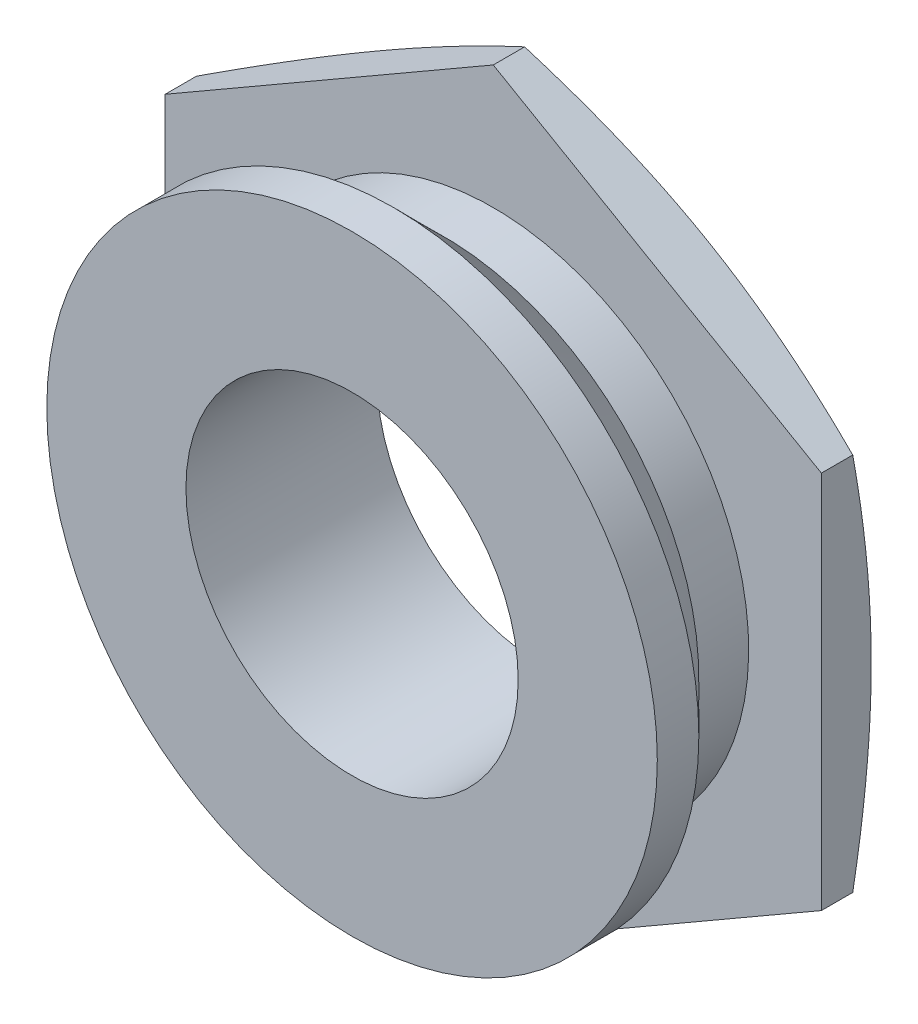
ISO-10303-21;
HEADER;
FILE_DESCRIPTION(('STEP AP214'),'2;1');
FILE_NAME('part.step','',(''),(''),'','','');
FILE_SCHEMA(('AUTOMOTIVE_DESIGN { 1 0 10303 214 1 1 1 1 }'));
ENDSEC;
DATA;
#1=APPLICATION_CONTEXT('core data for automotive mechanical design processes');
#2=APPLICATION_PROTOCOL_DEFINITION('international standard','automotive_design',2000,#1);
#3=PRODUCT_CONTEXT('',#1,'mechanical');
#4=PRODUCT('Part','Part','',(#3));
#5=PRODUCT_RELATED_PRODUCT_CATEGORY('part','',(#4));
#6=PRODUCT_DEFINITION_FORMATION('','',#4);
#7=PRODUCT_DEFINITION_CONTEXT('part definition',#1,'design');
#8=PRODUCT_DEFINITION('design','',#6,#7);
#9=PRODUCT_DEFINITION_SHAPE('','',#8);
#10=(LENGTH_UNIT() NAMED_UNIT(*) SI_UNIT(.MILLI.,.METRE.));
#11=(NAMED_UNIT(*) PLANE_ANGLE_UNIT() SI_UNIT($,.RADIAN.));
#12=(NAMED_UNIT(*) SI_UNIT($,.STERADIAN.) SOLID_ANGLE_UNIT());
#13=UNCERTAINTY_MEASURE_WITH_UNIT(LENGTH_MEASURE(1.E-05),#10,'distance_accuracy_value','');
#14=(GEOMETRIC_REPRESENTATION_CONTEXT(3) GLOBAL_UNCERTAINTY_ASSIGNED_CONTEXT((#13)) GLOBAL_UNIT_ASSIGNED_CONTEXT((#10,
#11,#12)) REPRESENTATION_CONTEXT('',''));
#15=CARTESIAN_POINT('',(0.,0.,0.));
#16=DIRECTION('',(0.,0.,1.));
#17=DIRECTION('',(1.,0.,0.));
#18=AXIS2_PLACEMENT_3D('',#15,#16,#17);
#19=CARTESIAN_POINT('',(0.,3.075,0.));
#20=DIRECTION('',(0.,0.,1.));
#21=DIRECTION('',(0.,-1.,0.));
#22=AXIS2_PLACEMENT_3D('',#19,#20,#21);
#23=PLANE('',#22);
#24=DIRECTION('',(-0.866025403784439,-0.5,0.));
#25=VECTOR('',#24,1.);
#26=CARTESIAN_POINT('',(3.95,-2.28053356329902,0.));
#27=LINE('',#26,#25);
#28=CARTESIAN_POINT('',(3.95,-2.28053356329902,0.));
#29=VERTEX_POINT('',#28);
#30=CARTESIAN_POINT('',(0.,-4.56106712659804,0.));
#31=VERTEX_POINT('',#30);
#32=EDGE_CURVE('E149',#29,#31,#27,.T.);
#33=ORIENTED_EDGE('',*,*,#32,.F.);
#34=DIRECTION('',(0.,-1.,0.));
#35=VECTOR('',#34,1.);
#36=CARTESIAN_POINT('',(3.95,2.28053356329902,0.));
#37=LINE('',#36,#35);
#38=CARTESIAN_POINT('',(3.95,2.28053356329902,0.));
#39=VERTEX_POINT('',#38);
#40=EDGE_CURVE('E141',#39,#29,#37,.T.);
#41=ORIENTED_EDGE('',*,*,#40,.F.);
#42=DIRECTION('',(0.866025403784439,-0.5,0.));
#43=VECTOR('',#42,1.);
#44=CARTESIAN_POINT('',(0.,4.56106712659804,0.));
#45=LINE('',#44,#43);
#46=CARTESIAN_POINT('',(0.,4.56106712659804,0.));
#47=VERTEX_POINT('',#46);
#48=EDGE_CURVE('E156',#47,#39,#45,.T.);
#49=ORIENTED_EDGE('',*,*,#48,.F.);
#50=DIRECTION('',(0.866025403784439,0.5,0.));
#51=VECTOR('',#50,1.);
#52=CARTESIAN_POINT('',(-3.95,2.28053356329902,0.));
#53=LINE('',#52,#51);
#54=CARTESIAN_POINT('',(-3.95,2.28053356329902,0.));
#55=VERTEX_POINT('',#54);
#56=EDGE_CURVE('E133',#55,#47,#53,.T.);
#57=ORIENTED_EDGE('',*,*,#56,.F.);
#58=DIRECTION('',(0.,1.,0.));
#59=VECTOR('',#58,1.);
#60=CARTESIAN_POINT('',(-3.95,-2.28053356329902,0.));
#61=LINE('',#60,#59);
#62=CARTESIAN_POINT('',(-3.95,-2.28053356329902,0.));
#63=VERTEX_POINT('',#62);
#64=EDGE_CURVE('E132',#63,#55,#61,.T.);
#65=ORIENTED_EDGE('',*,*,#64,.F.);
#66=DIRECTION('',(-0.866025403784439,0.5,0.));
#67=VECTOR('',#66,1.);
#68=CARTESIAN_POINT('',(0.,-4.56106712659804,0.));
#69=LINE('',#68,#67);
#70=EDGE_CURVE('E145',#31,#63,#69,.T.);
#71=ORIENTED_EDGE('',*,*,#70,.F.);
#72=EDGE_LOOP('',(#33,#41,#49,#57,#65,#71));
#73=FACE_BOUND('',#72,.T.);
#74=CARTESIAN_POINT('',(0.,0.,0.));
#75=DIRECTION('',(0.,0.,1.));
#76=DIRECTION('',(0.,-1.,0.));
#77=AXIS2_PLACEMENT_3D('',#74,#75,#76);
#78=CIRCLE('',#77,3.075);
#79=CARTESIAN_POINT('',(0.,-3.075,0.));
#80=VERTEX_POINT('',#79);
#81=EDGE_CURVE('E166',#80,#80,#78,.T.);
#82=ORIENTED_EDGE('',*,*,#81,.F.);
#83=EDGE_LOOP('',(#82));
#84=FACE_BOUND('',#83,.T.);
#85=ADVANCED_FACE('F39',(#73,#84),#23,.T.);
#86=CARTESIAN_POINT('',(0.,0.,1.7));
#87=DIRECTION('',(0.,0.,1.));
#88=DIRECTION('',(0.,-1.,0.));
#89=AXIS2_PLACEMENT_3D('',#86,#87,#88);
#90=CYLINDRICAL_SURFACE('',#89,3.075);
#91=ORIENTED_EDGE('',*,*,#81,.T.);
#92=EDGE_LOOP('',(#91));
#93=FACE_BOUND('',#92,.T.);
#94=CARTESIAN_POINT('',(0.,0.,0.600000000000001));
#95=DIRECTION('',(0.,0.,1.));
#96=DIRECTION('',(0.,-1.,0.));
#97=AXIS2_PLACEMENT_3D('',#94,#95,#96);
#98=CIRCLE('',#97,3.075);
#99=CARTESIAN_POINT('',(0.,-3.075,0.600000000000001));
#100=VERTEX_POINT('',#99);
#101=EDGE_CURVE('E164',#100,#100,#98,.T.);
#102=ORIENTED_EDGE('',*,*,#101,.F.);
#103=EDGE_LOOP('',(#102));
#104=FACE_BOUND('',#103,.T.);
#105=ADVANCED_FACE('F252',(#93,#104),#90,.T.);
#106=CARTESIAN_POINT('',(0.,0.,1.2));
#107=DIRECTION('',(0.,0.,1.));
#108=DIRECTION('',(0.,-1.,0.));
#109=AXIS2_PLACEMENT_3D('',#106,#107,#108);
#110=CONICAL_SURFACE('',#109,3.675,0.785398163397448);
#111=ORIENTED_EDGE('',*,*,#101,.T.);
#112=EDGE_LOOP('',(#111));
#113=FACE_BOUND('',#112,.T.);
#114=CARTESIAN_POINT('',(0.,0.,1.2));
#115=DIRECTION('',(0.,0.,1.));
#116=DIRECTION('',(0.,-1.,0.));
#117=AXIS2_PLACEMENT_3D('',#114,#115,#116);
#118=CIRCLE('',#117,3.675);
#119=CARTESIAN_POINT('',(0.,-3.675,1.2));
#120=VERTEX_POINT('',#119);
#121=EDGE_CURVE('E161',#120,#120,#118,.T.);
#122=ORIENTED_EDGE('',*,*,#121,.F.);
#123=EDGE_LOOP('',(#122));
#124=FACE_BOUND('',#123,.T.);
#125=ADVANCED_FACE('F259',(#113,#124),#110,.T.);
#126=CARTESIAN_POINT('',(0.,0.,1.7));
#127=DIRECTION('',(0.,0.,1.));
#128=DIRECTION('',(0.,-1.,0.));
#129=AXIS2_PLACEMENT_3D('',#126,#127,#128);
#130=CYLINDRICAL_SURFACE('',#129,3.675);
#131=ORIENTED_EDGE('',*,*,#121,.T.);
#132=EDGE_LOOP('',(#131));
#133=FACE_BOUND('',#132,.T.);
#134=CARTESIAN_POINT('',(0.,0.,1.7));
#135=DIRECTION('',(0.,0.,1.));
#136=DIRECTION('',(0.,-1.,0.));
#137=AXIS2_PLACEMENT_3D('',#134,#135,#136);
#138=CIRCLE('',#137,3.675);
#139=CARTESIAN_POINT('',(0.,-3.675,1.7));
#140=VERTEX_POINT('',#139);
#141=EDGE_CURVE('E158',#140,#140,#138,.T.);
#142=ORIENTED_EDGE('',*,*,#141,.F.);
#143=EDGE_LOOP('',(#142));
#144=FACE_BOUND('',#143,.T.);
#145=ADVANCED_FACE('F265',(#133,#144),#130,.T.);
#146=CARTESIAN_POINT('',(0.,3.675,1.7));
#147=DIRECTION('',(0.,0.,1.));
#148=DIRECTION('',(0.,-1.,0.));
#149=AXIS2_PLACEMENT_3D('',#146,#147,#148);
#150=PLANE('',#149);
#151=CARTESIAN_POINT('',(0.,0.,1.7));
#152=DIRECTION('',(0.,0.,-1.));
#153=DIRECTION('',(-1.,0.,0.));
#154=AXIS2_PLACEMENT_3D('',#151,#152,#153);
#155=CIRCLE('',#154,2.);
#156=CARTESIAN_POINT('',(-2.,0.,1.7));
#157=VERTEX_POINT('',#156);
#158=EDGE_CURVE('E292',#157,#157,#155,.T.);
#159=ORIENTED_EDGE('',*,*,#158,.T.);
#160=EDGE_LOOP('',(#159));
#161=FACE_BOUND('',#160,.T.);
#162=ORIENTED_EDGE('',*,*,#141,.T.);
#163=EDGE_LOOP('',(#162));
#164=FACE_BOUND('',#163,.T.);
#165=ADVANCED_FACE('F268',(#161,#164),#150,.T.);
#166=CARTESIAN_POINT('',(0.,4.56106712659804,12.0674493300504));
#167=DIRECTION('',(0.5,0.866025403784439,0.));
#168=DIRECTION('',(-0.866025403784439,0.5,0.));
#169=AXIS2_PLACEMENT_3D('',#166,#167,#168);
#170=PLANE('',#169);
#171=CARTESIAN_POINT('',(-0.000200000000000009,4.56118259665188,-0.377547725521246));
#172=CARTESIAN_POINT('',(0.163394645638989,4.46673118395423,-0.411939136315846));
#173=CARTESIAN_POINT('',(0.327528779089733,4.37196829782324,-0.443224156372785));
#174=CARTESIAN_POINT('',(0.656864333361271,4.18182632691085,-0.49826540675319));
#175=CARTESIAN_POINT('',(0.82206648688232,4.08644681910477,-0.522015744883351));
#176=CARTESIAN_POINT('',(1.1517045911922,3.8961301708463,-0.560431271655497));
#177=CARTESIAN_POINT('',(1.31613301273488,3.80119737740621,-0.575180255897328));
#178=CARTESIAN_POINT('',(1.64537440115126,3.61110977317565,-0.594962798298042));
#179=CARTESIAN_POINT('',(1.81018720057563,3.51595505906209,-0.599999999999999));
#180=CARTESIAN_POINT('',(2.13981279942437,3.32564563083498,-0.599999999999999));
#181=CARTESIAN_POINT('',(2.30462559884874,3.23049091672142,-0.594962798298042));
#182=CARTESIAN_POINT('',(2.63386698726512,3.04040331249086,-0.575180255897328));
#183=CARTESIAN_POINT('',(2.7982954088078,2.94547051905077,-0.560431271655497));
#184=CARTESIAN_POINT('',(3.12793351311768,2.7551538707923,-0.522015744883351));
#185=CARTESIAN_POINT('',(3.29313566663873,2.65977436298622,-0.49826540675319));
#186=CARTESIAN_POINT('',(3.62247122091027,2.46963239207383,-0.443224156372785));
#187=CARTESIAN_POINT('',(3.78660535436101,2.37486950594284,-0.411939136315846));
#188=CARTESIAN_POINT('',(3.9502,2.28041809324519,-0.377547725521245));
#189=B_SPLINE_CURVE_WITH_KNOTS('',3,(#171,#172,#173,#174,#175,#176,#177,#178,#179,#180,#181,
#182,#183,#184,#185,#186,#187,#188),.UNSPECIFIED.,.F.,.F.,(4,2,2,2,2,2,2,2,4),(0.,
0.576083228362151,1.15261585512616,1.72369611610119,2.29456208472354,2.86542805334588,
3.43650831432091,4.01304094108492,4.58912416944707),.UNSPECIFIED.);
#190=CARTESIAN_POINT('',(0.,4.56106712659804,-0.377589754779738));
#191=VERTEX_POINT('',#190);
#192=CARTESIAN_POINT('',(1.975,3.42080034494853,-0.599999999999999));
#193=VERTEX_POINT('',#192);
#194=EDGE_CURVE('E283',#191,#193,#189,.T.);
#195=ORIENTED_EDGE('',*,*,#194,.F.);
#196=DIRECTION('',(0.,0.,-1.));
#197=VECTOR('',#196,1.);
#198=CARTESIAN_POINT('',(0.,4.56106712659804,12.0674493300504));
#199=LINE('',#198,#197);
#200=EDGE_CURVE('E135',#47,#191,#199,.T.);
#201=ORIENTED_EDGE('',*,*,#200,.F.);
#202=ORIENTED_EDGE('',*,*,#48,.T.);
#203=DIRECTION('',(0.,0.,-1.));
#204=VECTOR('',#203,1.);
#205=CARTESIAN_POINT('',(3.95,2.28053356329902,12.0674493300504));
#206=LINE('',#205,#204);
#207=CARTESIAN_POINT('',(3.95,2.28053356329903,-0.377589754779738));
#208=VERTEX_POINT('',#207);
#209=EDGE_CURVE('E153',#39,#208,#206,.T.);
#210=ORIENTED_EDGE('',*,*,#209,.T.);
#211=EDGE_CURVE('E277',#193,#208,#189,.T.);
#212=ORIENTED_EDGE('',*,*,#211,.F.);
#213=EDGE_LOOP('',(#195,#201,#202,#210,#212));
#214=FACE_BOUND('',#213,.T.);
#215=ADVANCED_FACE('F272',(#214),#170,.T.);
#216=CARTESIAN_POINT('',(3.95,2.28053356329902,12.0674493300504));
#217=DIRECTION('',(1.,0.,0.));
#218=DIRECTION('',(0.,1.,0.));
#219=AXIS2_PLACEMENT_3D('',#216,#217,#218);
#220=PLANE('',#219);
#221=CARTESIAN_POINT('',(3.95,-6.03805098489355,0.588472147348961));
#222=CARTESIAN_POINT('',(3.95,-5.85933869988011,0.534054324238001));
#223=CARTESIAN_POINT('',(3.95,-5.68042946739473,0.480271486300747));
#224=CARTESIAN_POINT('',(3.95,-5.32211684037161,0.374327053579596));
#225=CARTESIAN_POINT('',(3.95,-5.14271340794712,0.322165587085427));
#226=CARTESIAN_POINT('',(3.95,-4.78300504576268,0.219728399957085));
#227=CARTESIAN_POINT('',(3.95,-4.60269905854142,0.169456379229714));
#228=CARTESIAN_POINT('',(3.95,-4.241416366318,0.0713866322203015));
#229=CARTESIAN_POINT('',(3.95,-4.06043967342107,0.0235888615125296));
#230=CARTESIAN_POINT('',(3.95,-3.6999267765105,-0.0683504780592834));
#231=CARTESIAN_POINT('',(3.95,-3.52040024784364,-0.112529797910796));
#232=CARTESIAN_POINT('',(3.95,-3.16046294750332,-0.197124832577449));
#233=CARTESIAN_POINT('',(3.95,-2.98005220600987,-0.237540674919057));
#234=CARTESIAN_POINT('',(3.95,-2.618292490451,-0.313670032421782));
#235=CARTESIAN_POINT('',(3.95,-2.43694383168832,-0.349385033065053));
#236=CARTESIAN_POINT('',(3.95,-2.07319366031589,-0.41502399378753));
#237=CARTESIAN_POINT('',(3.95,-1.8907921831926,-0.444948147893586));
#238=CARTESIAN_POINT('',(3.95,-1.54547102153879,-0.494827468355308));
#239=CARTESIAN_POINT('',(3.95,-1.38265944413584,-0.515524101436541));
#240=CARTESIAN_POINT('',(3.95,-1.05635681627977,-0.550557384538961));
#241=CARTESIAN_POINT('',(3.95,-0.892865824206534,-0.564894570049616));
#242=CARTESIAN_POINT('',(3.95,-0.565522552709325,-0.586520515381504));
#243=CARTESIAN_POINT('',(3.95,-0.401670595034491,-0.59381406722805));
#244=CARTESIAN_POINT('',(3.95,-0.0738027609892456,-0.600982758327267));
#245=CARTESIAN_POINT('',(3.95,0.0902131142154053,-0.600857949968151));
#246=CARTESIAN_POINT('',(3.95,0.418900194710524,-0.593177383146434));
#247=CARTESIAN_POINT('',(3.95,0.583570504989359,-0.58558394174616));
#248=CARTESIAN_POINT('',(3.95,0.912427289391331,-0.56331515250934));
#249=CARTESIAN_POINT('',(3.95,1.07661375179499,-0.548639634530531));
#250=CARTESIAN_POINT('',(3.95,1.40442251762932,-0.512894731475785));
#251=CARTESIAN_POINT('',(3.95,1.56804421392796,-0.491819854594111));
#252=CARTESIAN_POINT('',(3.95,1.89446683958625,-0.444125383334469));
#253=CARTESIAN_POINT('',(3.95,2.05726776454209,-0.417505759238778));
#254=CARTESIAN_POINT('',(3.95,2.56158688558696,-0.327601137632812));
#255=CARTESIAN_POINT('',(3.95,2.90167554809464,-0.256319814583836));
#256=CARTESIAN_POINT('',(3.95,3.57869455397605,-0.100038633266692));
#257=CARTESIAN_POINT('',(3.95,3.91562371337153,-0.0150338338869124));
#258=CARTESIAN_POINT('',(3.95,4.58748518776409,0.164121164065658));
#259=CARTESIAN_POINT('',(3.95,4.92241435502613,0.258283053367429));
#260=CARTESIAN_POINT('',(3.95,5.59043474624669,0.452664416491018));
#261=CARTESIAN_POINT('',(3.95,5.92352625272211,0.552882929166195));
#262=CARTESIAN_POINT('',(3.95,6.58474397814754,0.756381777672387));
#263=CARTESIAN_POINT('',(3.95,6.91288442125019,0.859616107453526));
#264=CARTESIAN_POINT('',(3.95,7.56824257244402,1.06901711954946));
#265=CARTESIAN_POINT('',(3.95,7.89546023543049,1.17518394255509));
#266=CARTESIAN_POINT('',(3.95,8.54795230850632,1.38924813731862));
#267=CARTESIAN_POINT('',(3.95,8.87322938099829,1.497137414293));
#268=CARTESIAN_POINT('',(3.95,9.52321317990156,1.71453359512624));
#269=CARTESIAN_POINT('',(3.95,9.84791995108263,1.82404036501767));
#270=CARTESIAN_POINT('',(3.95,10.17243201379,1.93411301839285));
#271=B_SPLINE_CURVE_WITH_KNOTS('',3,(#221,#222,#223,#224,#225,#226,#227,#228,#229,#230,#231,
#232,#233,#234,#235,#236,#237,#238,#239,#240,#241,#242,#243,#244,#245,#246,#247,#248,#249,#250,
#251,#252,#253,#254,#255,#256,#257,#258,#259,#260,#261,#262,#263,#264,#265,#266,#267,#268,#269,
#270),.UNSPECIFIED.,.F.,.F.,(4,2,2,2,2,2,2,2,2,2,2,2,2,2,2,2,2,2,2,2,2,2,2,2,4),(0.,
0.560445245275148,1.12093472303445,1.68246993435923,2.2439950596901,2.79861092882412,
3.35320799780336,3.90762938927133,4.46203220119863,4.95428945287775,5.44650524676761,
5.93838593298634,6.43026314556039,6.92463491899961,7.41901856998896,7.91382769631081,
8.40863947468853,9.45056815185454,10.4928728135512,11.5365260910689,12.5800141803173,
13.6119843907916,14.6440041979027,15.6721081678377,16.7001274581947),.UNSPECIFIED.);
#272=CARTESIAN_POINT('',(3.95,0.,-0.599999999999999));
#273=VERTEX_POINT('',#272);
#274=EDGE_CURVE('E284',#208,#273,#271,.F.);
#275=ORIENTED_EDGE('',*,*,#274,.F.);
#276=ORIENTED_EDGE('',*,*,#209,.F.);
#277=ORIENTED_EDGE('',*,*,#40,.T.);
#278=DIRECTION('',(0.,0.,-1.));
#279=VECTOR('',#278,1.);
#280=CARTESIAN_POINT('',(3.95,-2.28053356329902,12.0674493300504));
#281=LINE('',#280,#279);
#282=CARTESIAN_POINT('',(3.95,-2.28053356329902,-0.377589754779738));
#283=VERTEX_POINT('',#282);
#284=EDGE_CURVE('E150',#29,#283,#281,.T.);
#285=ORIENTED_EDGE('',*,*,#284,.T.);
#286=EDGE_CURVE('E196',#273,#283,#271,.F.);
#287=ORIENTED_EDGE('',*,*,#286,.F.);
#288=EDGE_LOOP('',(#275,#276,#277,#285,#287));
#289=FACE_BOUND('',#288,.T.);
#290=ADVANCED_FACE('F250',(#289),#220,.T.);
#291=CARTESIAN_POINT('',(3.95,-2.28053356329902,12.0674493300504));
#292=DIRECTION('',(0.5,-0.866025403784439,0.));
#293=DIRECTION('',(0.866025403784439,0.5,0.));
#294=AXIS2_PLACEMENT_3D('',#291,#292,#293);
#295=PLANE('',#294);
#296=CARTESIAN_POINT('',(3.9502,-2.28041809324518,-0.377547725521246));
#297=CARTESIAN_POINT('',(3.78660535436101,-2.37486950594283,-0.411939136315845));
#298=CARTESIAN_POINT('',(3.62247122091027,-2.46963239207383,-0.443224156372785));
#299=CARTESIAN_POINT('',(3.29313566663873,-2.65977436298621,-0.49826540675319));
#300=CARTESIAN_POINT('',(3.12793351311768,-2.7551538707923,-0.522015744883352));
#301=CARTESIAN_POINT('',(2.7982954088078,-2.94547051905076,-0.560431271655497));
#302=CARTESIAN_POINT('',(2.63386698726512,-3.04040331249086,-0.575180255897328));
#303=CARTESIAN_POINT('',(2.30462559884874,-3.23049091672142,-0.594962798298042));
#304=CARTESIAN_POINT('',(2.13981279942437,-3.32564563083497,-0.6));
#305=CARTESIAN_POINT('',(1.81018720057563,-3.51595505906209,-0.6));
#306=CARTESIAN_POINT('',(1.64537440115126,-3.61110977317564,-0.594962798298043));
#307=CARTESIAN_POINT('',(1.31613301273488,-3.8011973774062,-0.575180255897329));
#308=CARTESIAN_POINT('',(1.1517045911922,-3.8961301708463,-0.560431271655498));
#309=CARTESIAN_POINT('',(0.822066486882319,-4.08644681910476,-0.522015744883352));
#310=CARTESIAN_POINT('',(0.65686433336127,-4.18182632691085,-0.498265406753191));
#311=CARTESIAN_POINT('',(0.327528779089732,-4.37196829782323,-0.443224156372786));
#312=CARTESIAN_POINT('',(0.163394645638988,-4.46673118395423,-0.411939136315846));
#313=CARTESIAN_POINT('',(-0.000200000000000613,-4.56118259665188,-0.377547725521247));
#314=B_SPLINE_CURVE_WITH_KNOTS('',3,(#296,#297,#298,#299,#300,#301,#302,#303,#304,#305,#306,
#307,#308,#309,#310,#311,#312,#313),.UNSPECIFIED.,.F.,.F.,(4,2,2,2,2,2,2,2,4),(0.,
0.576083228362151,1.15261585512617,1.72369611610119,2.29456208472354,2.86542805334588,
3.43650831432091,4.01304094108492,4.58912416944708),.UNSPECIFIED.);
#315=CARTESIAN_POINT('',(1.975,-3.42080034494853,-0.599999999999999));
#316=VERTEX_POINT('',#315);
#317=EDGE_CURVE('E192',#283,#316,#314,.T.);
#318=ORIENTED_EDGE('',*,*,#317,.F.);
#319=ORIENTED_EDGE('',*,*,#284,.F.);
#320=ORIENTED_EDGE('',*,*,#32,.T.);
#321=DIRECTION('',(0.,0.,-1.));
#322=VECTOR('',#321,1.);
#323=CARTESIAN_POINT('',(0.,-4.56106712659804,12.0674493300504));
#324=LINE('',#323,#322);
#325=CARTESIAN_POINT('',(0.,-4.56106712659804,-0.377589754779738));
#326=VERTEX_POINT('',#325);
#327=EDGE_CURVE('E146',#31,#326,#324,.T.);
#328=ORIENTED_EDGE('',*,*,#327,.T.);
#329=EDGE_CURVE('E184',#316,#326,#314,.T.);
#330=ORIENTED_EDGE('',*,*,#329,.F.);
#331=EDGE_LOOP('',(#318,#319,#320,#328,#330));
#332=FACE_BOUND('',#331,.T.);
#333=ADVANCED_FACE('F190',(#332),#295,.T.);
#334=CARTESIAN_POINT('',(0.,-4.56106712659804,12.0674493300504));
#335=DIRECTION('',(-0.5,-0.866025403784438,0.));
#336=DIRECTION('',(0.866025403784439,-0.5,0.));
#337=AXIS2_PLACEMENT_3D('',#334,#335,#336);
#338=PLANE('',#337);
#339=CARTESIAN_POINT('',(0.000199999999998326,-4.56118259665188,-0.377547725521246));
#340=CARTESIAN_POINT('',(-0.163394645638991,-4.46673118395423,-0.411939136315846));
#341=CARTESIAN_POINT('',(-0.327528779089735,-4.37196829782324,-0.443224156372786));
#342=CARTESIAN_POINT('',(-0.656864333361272,-4.18182632691085,-0.49826540675319));
#343=CARTESIAN_POINT('',(-0.822066486882321,-4.08644681910477,-0.522015744883352));
#344=CARTESIAN_POINT('',(-1.1517045911922,-3.8961301708463,-0.560431271655497));
#345=CARTESIAN_POINT('',(-1.31613301273488,-3.80119737740621,-0.575180255897328));
#346=CARTESIAN_POINT('',(-1.64537440115126,-3.61110977317565,-0.594962798298042));
#347=CARTESIAN_POINT('',(-1.81018720057563,-3.51595505906209,-0.599999999999999));
#348=CARTESIAN_POINT('',(-2.13981279942437,-3.32564563083497,-0.599999999999999));
#349=CARTESIAN_POINT('',(-2.30462559884875,-3.23049091672142,-0.594962798298042));
#350=CARTESIAN_POINT('',(-2.63386698726512,-3.04040331249086,-0.575180255897328));
#351=CARTESIAN_POINT('',(-2.7982954088078,-2.94547051905076,-0.560431271655497));
#352=CARTESIAN_POINT('',(-3.12793351311768,-2.7551538707923,-0.522015744883352));
#353=CARTESIAN_POINT('',(-3.29313566663873,-2.65977436298621,-0.49826540675319));
#354=CARTESIAN_POINT('',(-3.62247122091027,-2.46963239207383,-0.443224156372785));
#355=CARTESIAN_POINT('',(-3.78660535436101,-2.37486950594283,-0.411939136315846));
#356=CARTESIAN_POINT('',(-3.9502,-2.28041809324518,-0.377547725521246));
#357=B_SPLINE_CURVE_WITH_KNOTS('',3,(#339,#340,#341,#342,#343,#344,#345,#346,#347,#348,#349,
#350,#351,#352,#353,#354,#355,#356),.UNSPECIFIED.,.F.,.F.,(4,2,2,2,2,2,2,2,4),(0.,
0.576083228362151,1.15261585512616,1.72369611610119,2.29456208472354,2.86542805334588,
3.43650831432091,4.01304094108492,4.58912416944707),.UNSPECIFIED.);
#358=CARTESIAN_POINT('',(-1.975,-3.42080034494853,-0.599999999999999));
#359=VERTEX_POINT('',#358);
#360=EDGE_CURVE('E62',#326,#359,#357,.T.);
#361=ORIENTED_EDGE('',*,*,#360,.F.);
#362=ORIENTED_EDGE('',*,*,#327,.F.);
#363=ORIENTED_EDGE('',*,*,#70,.T.);
#364=DIRECTION('',(0.,0.,-1.));
#365=VECTOR('',#364,1.);
#366=CARTESIAN_POINT('',(-3.95,-2.28053356329902,12.0674493300504));
#367=LINE('',#366,#365);
#368=CARTESIAN_POINT('',(-3.95,-2.28053356329903,-0.377589754779738));
#369=VERTEX_POINT('',#368);
#370=EDGE_CURVE('E137',#63,#369,#367,.T.);
#371=ORIENTED_EDGE('',*,*,#370,.T.);
#372=EDGE_CURVE('E197',#359,#369,#357,.T.);
#373=ORIENTED_EDGE('',*,*,#372,.F.);
#374=EDGE_LOOP('',(#361,#362,#363,#371,#373));
#375=FACE_BOUND('',#374,.T.);
#376=ADVANCED_FACE('F243',(#375),#338,.T.);
#377=CARTESIAN_POINT('',(-3.95,-2.28053356329902,12.0674493300504));
#378=DIRECTION('',(-1.,0.,0.));
#379=DIRECTION('',(0.,0.,1.));
#380=AXIS2_PLACEMENT_3D('',#377,#378,#379);
#381=PLANE('',#380);
#382=CARTESIAN_POINT('',(-3.95,-6.03805098489355,0.58847214734896));
#383=CARTESIAN_POINT('',(-3.95,-5.85933869988011,0.534054324238));
#384=CARTESIAN_POINT('',(-3.95,-5.68042946739473,0.480271486300745));
#385=CARTESIAN_POINT('',(-3.95,-5.3221168403716,0.374327053579595));
#386=CARTESIAN_POINT('',(-3.95,-5.14271340794712,0.322165587085426));
#387=CARTESIAN_POINT('',(-3.95,-4.78300504576267,0.219728399957084));
#388=CARTESIAN_POINT('',(-3.95,-4.60269905854142,0.169456379229713));
#389=CARTESIAN_POINT('',(-3.95,-4.24141636631799,0.0713866322203001));
#390=CARTESIAN_POINT('',(-3.95,-4.06043967342107,0.0235888615125284));
#391=CARTESIAN_POINT('',(-3.95,-3.6999267765105,-0.0683504780592844));
#392=CARTESIAN_POINT('',(-3.95,-3.52040024784364,-0.112529797910797));
#393=CARTESIAN_POINT('',(-3.95,-3.16046294750331,-0.19712483257745));
#394=CARTESIAN_POINT('',(-3.95,-2.98005220600987,-0.237540674919057));
#395=CARTESIAN_POINT('',(-3.95,-2.618292490451,-0.313670032421782));
#396=CARTESIAN_POINT('',(-3.95,-2.43694383168832,-0.349385033065054));
#397=CARTESIAN_POINT('',(-3.95,-2.07319366031589,-0.415023993787531));
#398=CARTESIAN_POINT('',(-3.95,-1.8907921831926,-0.444948147893587));
#399=CARTESIAN_POINT('',(-3.95,-1.54547102153879,-0.494827468355308));
#400=CARTESIAN_POINT('',(-3.95,-1.38265944413584,-0.515524101436541));
#401=CARTESIAN_POINT('',(-3.95,-1.05635681627977,-0.550557384538961));
#402=CARTESIAN_POINT('',(-3.95,-0.892865824206535,-0.564894570049616));
#403=CARTESIAN_POINT('',(-3.95,-0.565522552709326,-0.586520515381504));
#404=CARTESIAN_POINT('',(-3.95,-0.401670595034492,-0.593814067228051));
#405=CARTESIAN_POINT('',(-3.95,-0.0738027609892468,-0.600982758327267));
#406=CARTESIAN_POINT('',(-3.95,0.0902131142154041,-0.600857949968151));
#407=CARTESIAN_POINT('',(-3.95,0.418900194710523,-0.593177383146434));
#408=CARTESIAN_POINT('',(-3.95,0.583570504989358,-0.58558394174616));
#409=CARTESIAN_POINT('',(-3.95,0.91242728939133,-0.56331515250934));
#410=CARTESIAN_POINT('',(-3.95,1.07661375179499,-0.548639634530531));
#411=CARTESIAN_POINT('',(-3.95,1.40442251762932,-0.512894731475785));
#412=CARTESIAN_POINT('',(-3.95,1.56804421392796,-0.491819854594111));
#413=CARTESIAN_POINT('',(-3.95,1.89446683958625,-0.444125383334469));
#414=CARTESIAN_POINT('',(-3.95,2.05726776454209,-0.417505759238778));
#415=CARTESIAN_POINT('',(-3.95,2.56158688558696,-0.327601137632812));
#416=CARTESIAN_POINT('',(-3.95,2.90167554809464,-0.256319814583836));
#417=CARTESIAN_POINT('',(-3.95,3.57869455397605,-0.100038633266692));
#418=CARTESIAN_POINT('',(-3.95,3.91562371337153,-0.0150338338869116));
#419=CARTESIAN_POINT('',(-3.95,4.58748518776409,0.164121164065659));
#420=CARTESIAN_POINT('',(-3.95,4.92241435502614,0.25828305336743));
#421=CARTESIAN_POINT('',(-3.95,5.5904347462467,0.452664416491019));
#422=CARTESIAN_POINT('',(-3.95,5.92352625272211,0.552882929166197));
#423=CARTESIAN_POINT('',(-3.95,6.58474397814754,0.756381777672389));
#424=CARTESIAN_POINT('',(-3.95,6.91288442125019,0.859616107453528));
#425=CARTESIAN_POINT('',(-3.95,7.56824257244403,1.06901711954946));
#426=CARTESIAN_POINT('',(-3.95,7.8954602354305,1.17518394255509));
#427=CARTESIAN_POINT('',(-3.95,8.54795230850633,1.38924813731863));
#428=CARTESIAN_POINT('',(-3.95,8.8732293809983,1.497137414293));
#429=CARTESIAN_POINT('',(-3.95,9.52321317990157,1.71453359512624));
#430=CARTESIAN_POINT('',(-3.95,9.84791995108264,1.82404036501767));
#431=CARTESIAN_POINT('',(-3.95,10.17243201379,1.93411301839285));
#432=B_SPLINE_CURVE_WITH_KNOTS('',3,(#382,#383,#384,#385,#386,#387,#388,#389,#390,#391,#392,
#393,#394,#395,#396,#397,#398,#399,#400,#401,#402,#403,#404,#405,#406,#407,#408,#409,#410,#411,
#412,#413,#414,#415,#416,#417,#418,#419,#420,#421,#422,#423,#424,#425,#426,#427,#428,#429,#430,
#431),.UNSPECIFIED.,.F.,.F.,(4,2,2,2,2,2,2,2,2,2,2,2,2,2,2,2,2,2,2,2,2,2,2,2,4),(0.,
0.560445245275149,1.12093472303445,1.68246993435923,2.2439950596901,2.79861092882412,
3.35320799780336,3.90762938927133,4.46203220119863,4.95428945287775,5.44650524676761,
5.93838593298634,6.43026314556039,6.92463491899961,7.41901856998896,7.9138276963108,
8.40863947468853,9.45056815185454,10.4928728135512,11.5365260910689,12.5800141803173,
13.6119843907916,14.6440041979027,15.6721081678377,16.7001274581947),.UNSPECIFIED.);
#433=CARTESIAN_POINT('',(-3.95,0.,-0.599999999999999));
#434=VERTEX_POINT('',#433);
#435=EDGE_CURVE('E54',#369,#434,#432,.T.);
#436=ORIENTED_EDGE('',*,*,#435,.F.);
#437=ORIENTED_EDGE('',*,*,#370,.F.);
#438=ORIENTED_EDGE('',*,*,#64,.T.);
#439=DIRECTION('',(0.,0.,-1.));
#440=VECTOR('',#439,1.);
#441=CARTESIAN_POINT('',(-3.95,2.28053356329902,12.0674493300504));
#442=LINE('',#441,#440);
#443=CARTESIAN_POINT('',(-3.95,2.28053356329902,-0.377589754779738));
#444=VERTEX_POINT('',#443);
#445=EDGE_CURVE('E125',#55,#444,#442,.T.);
#446=ORIENTED_EDGE('',*,*,#445,.T.);
#447=EDGE_CURVE('E111',#434,#444,#432,.T.);
#448=ORIENTED_EDGE('',*,*,#447,.F.);
#449=EDGE_LOOP('',(#436,#437,#438,#446,#448));
#450=FACE_BOUND('',#449,.T.);
#451=ADVANCED_FACE('F130',(#450),#381,.T.);
#452=CARTESIAN_POINT('',(-3.95,2.28053356329902,12.0674493300504));
#453=DIRECTION('',(-0.5,0.866025403784439,0.));
#454=DIRECTION('',(-0.866025403784439,-0.5,0.));
#455=AXIS2_PLACEMENT_3D('',#452,#453,#454);
#456=PLANE('',#455);
#457=CARTESIAN_POINT('',(-3.9502,2.28041809324519,-0.377547725521245));
#458=CARTESIAN_POINT('',(-3.78660535436101,2.37486950594284,-0.411939136315845));
#459=CARTESIAN_POINT('',(-3.62247122091027,2.46963239207383,-0.443224156372784));
#460=CARTESIAN_POINT('',(-3.29313566663873,2.65977436298622,-0.49826540675319));
#461=CARTESIAN_POINT('',(-3.12793351311768,2.7551538707923,-0.522015744883351));
#462=CARTESIAN_POINT('',(-2.7982954088078,2.94547051905077,-0.560431271655497));
#463=CARTESIAN_POINT('',(-2.63386698726512,3.04040331249086,-0.575180255897328));
#464=CARTESIAN_POINT('',(-2.30462559884874,3.23049091672142,-0.594962798298041));
#465=CARTESIAN_POINT('',(-2.13981279942437,3.32564563083498,-0.599999999999999));
#466=CARTESIAN_POINT('',(-1.81018720057563,3.51595505906209,-0.599999999999999));
#467=CARTESIAN_POINT('',(-1.64537440115125,3.61110977317565,-0.594962798298041));
#468=CARTESIAN_POINT('',(-1.31613301273488,3.80119737740621,-0.575180255897328));
#469=CARTESIAN_POINT('',(-1.1517045911922,3.8961301708463,-0.560431271655497));
#470=CARTESIAN_POINT('',(-0.822066486882319,4.08644681910477,-0.522015744883351));
#471=CARTESIAN_POINT('',(-0.65686433336127,4.18182632691085,-0.49826540675319));
#472=CARTESIAN_POINT('',(-0.327528779089733,4.37196829782324,-0.443224156372785));
#473=CARTESIAN_POINT('',(-0.163394645638988,4.46673118395423,-0.411939136315845));
#474=CARTESIAN_POINT('',(0.00020000000000066,4.56118259665188,-0.377547725521245));
#475=B_SPLINE_CURVE_WITH_KNOTS('',3,(#457,#458,#459,#460,#461,#462,#463,#464,#465,#466,#467,
#468,#469,#470,#471,#472,#473,#474),.UNSPECIFIED.,.F.,.F.,(4,2,2,2,2,2,2,2,4),(0.,
0.576083228362151,1.15261585512616,1.72369611610119,2.29456208472354,2.86542805334588,
3.43650831432091,4.01304094108492,4.58912416944707),.UNSPECIFIED.);
#476=CARTESIAN_POINT('',(-1.975,3.42080034494853,-0.6));
#477=VERTEX_POINT('',#476);
#478=EDGE_CURVE('E114',#444,#477,#475,.T.);
#479=ORIENTED_EDGE('',*,*,#478,.F.);
#480=ORIENTED_EDGE('',*,*,#445,.F.);
#481=ORIENTED_EDGE('',*,*,#56,.T.);
#482=ORIENTED_EDGE('',*,*,#200,.T.);
#483=EDGE_CURVE('E127',#477,#191,#475,.T.);
#484=ORIENTED_EDGE('',*,*,#483,.F.);
#485=EDGE_LOOP('',(#479,#480,#481,#482,#484));
#486=FACE_BOUND('',#485,.T.);
#487=ADVANCED_FACE('F123',(#486),#456,.T.);
#488=CARTESIAN_POINT('',(0.,0.,-0.377589754779738));
#489=DIRECTION('',(0.,0.,1.));
#490=DIRECTION('',(1.,0.,0.));
#491=AXIS2_PLACEMENT_3D('',#488,#489,#490);
#492=CONICAL_SURFACE('',#491,4.56106712659804,1.22173047639604);
#493=ORIENTED_EDGE('',*,*,#194,.T.);
#494=CARTESIAN_POINT('',(0.,0.,-0.599999999999999));
#495=DIRECTION('',(0.,0.,-1.));
#496=DIRECTION('',(0.,1.,0.));
#497=AXIS2_PLACEMENT_3D('',#494,#495,#496);
#498=CIRCLE('',#497,3.95);
#499=EDGE_CURVE('E43',#193,#477,#498,.F.);
#500=ORIENTED_EDGE('',*,*,#499,.T.);
#501=ORIENTED_EDGE('',*,*,#483,.T.);
#502=EDGE_LOOP('',(#493,#500,#501));
#503=FACE_BOUND('',#502,.T.);
#504=ADVANCED_FACE('F223',(#503),#492,.T.);
#505=ORIENTED_EDGE('',*,*,#211,.T.);
#506=ORIENTED_EDGE('',*,*,#274,.T.);
#507=EDGE_CURVE('E171',#273,#193,#498,.F.);
#508=ORIENTED_EDGE('',*,*,#507,.T.);
#509=EDGE_LOOP('',(#505,#506,#508));
#510=FACE_BOUND('',#509,.T.);
#511=ADVANCED_FACE('F337',(#510),#492,.T.);
#512=ORIENTED_EDGE('',*,*,#286,.T.);
#513=ORIENTED_EDGE('',*,*,#317,.T.);
#514=EDGE_CURVE('E175',#316,#273,#498,.F.);
#515=ORIENTED_EDGE('',*,*,#514,.T.);
#516=EDGE_LOOP('',(#512,#513,#515));
#517=FACE_BOUND('',#516,.T.);
#518=ADVANCED_FACE('F331',(#517),#492,.T.);
#519=ORIENTED_EDGE('',*,*,#329,.T.);
#520=ORIENTED_EDGE('',*,*,#360,.T.);
#521=EDGE_CURVE('E48',#359,#316,#498,.F.);
#522=ORIENTED_EDGE('',*,*,#521,.T.);
#523=EDGE_LOOP('',(#519,#520,#522));
#524=FACE_BOUND('',#523,.T.);
#525=ADVANCED_FACE('F182',(#524),#492,.T.);
#526=ORIENTED_EDGE('',*,*,#372,.T.);
#527=ORIENTED_EDGE('',*,*,#435,.T.);
#528=EDGE_CURVE('E11',#434,#359,#498,.F.);
#529=ORIENTED_EDGE('',*,*,#528,.T.);
#530=EDGE_LOOP('',(#526,#527,#529));
#531=FACE_BOUND('',#530,.T.);
#532=ADVANCED_FACE('F222',(#531),#492,.T.);
#533=ORIENTED_EDGE('',*,*,#447,.T.);
#534=ORIENTED_EDGE('',*,*,#478,.T.);
#535=CARTESIAN_POINT('',(0.,0.,-0.599999999999999));
#536=DIRECTION('',(0.,0.,-1.));
#537=DIRECTION('',(-1.,0.,0.));
#538=AXIS2_PLACEMENT_3D('',#535,#536,#537);
#539=CIRCLE('',#538,3.95);
#540=EDGE_CURVE('E116',#434,#477,#539,.T.);
#541=ORIENTED_EDGE('',*,*,#540,.F.);
#542=EDGE_LOOP('',(#533,#534,#541));
#543=FACE_BOUND('',#542,.T.);
#544=ADVANCED_FACE('F113',(#543),#492,.T.);
#545=CARTESIAN_POINT('',(0.,3.95,-0.6));
#546=DIRECTION('',(0.,0.,-1.));
#547=DIRECTION('',(0.,1.,0.));
#548=AXIS2_PLACEMENT_3D('',#545,#546,#547);
#549=PLANE('',#548);
#550=CARTESIAN_POINT('',(0.,0.,-0.6));
#551=DIRECTION('',(0.,0.,-1.));
#552=DIRECTION('',(-1.,0.,0.));
#553=AXIS2_PLACEMENT_3D('',#550,#551,#552);
#554=CIRCLE('',#553,2.);
#555=CARTESIAN_POINT('',(-2.,0.,-0.6));
#556=VERTEX_POINT('',#555);
#557=EDGE_CURVE('E290',#556,#556,#554,.T.);
#558=ORIENTED_EDGE('',*,*,#557,.F.);
#559=EDGE_LOOP('',(#558));
#560=FACE_BOUND('',#559,.T.);
#561=ORIENTED_EDGE('',*,*,#540,.T.);
#562=ORIENTED_EDGE('',*,*,#499,.F.);
#563=ORIENTED_EDGE('',*,*,#507,.F.);
#564=ORIENTED_EDGE('',*,*,#514,.F.);
#565=ORIENTED_EDGE('',*,*,#521,.F.);
#566=ORIENTED_EDGE('',*,*,#528,.F.);
#567=EDGE_LOOP('',(#561,#562,#563,#564,#565,#566));
#568=FACE_BOUND('',#567,.T.);
#569=ADVANCED_FACE('F41',(#560,#568),#549,.T.);
#570=CARTESIAN_POINT('',(0.,0.,-0.599999999999999));
#571=DIRECTION('',(0.,0.,-1.));
#572=DIRECTION('',(-1.,0.,0.));
#573=AXIS2_PLACEMENT_3D('',#570,#571,#572);
#574=CYLINDRICAL_SURFACE('',#573,2.);
#575=ORIENTED_EDGE('',*,*,#158,.F.);
#576=EDGE_LOOP('',(#575));
#577=FACE_BOUND('',#576,.T.);
#578=ORIENTED_EDGE('',*,*,#557,.T.);
#579=EDGE_LOOP('',(#578));
#580=FACE_BOUND('',#579,.T.);
#581=ADVANCED_FACE('F224',(#577,#580),#574,.F.);
#582=CLOSED_SHELL('',(#85,#105,#125,#145,#165,#215,#290,#333,#376,#451,#487,#504,#511,#518,#525,
#532,#544,#569,#581));
#583=MANIFOLD_SOLID_BREP('B2',#582);
#584=ADVANCED_BREP_SHAPE_REPRESENTATION('',(#18,#583),#14);
#585=SHAPE_DEFINITION_REPRESENTATION(#9,#584);
ENDSEC;
END-ISO-10303-21;
